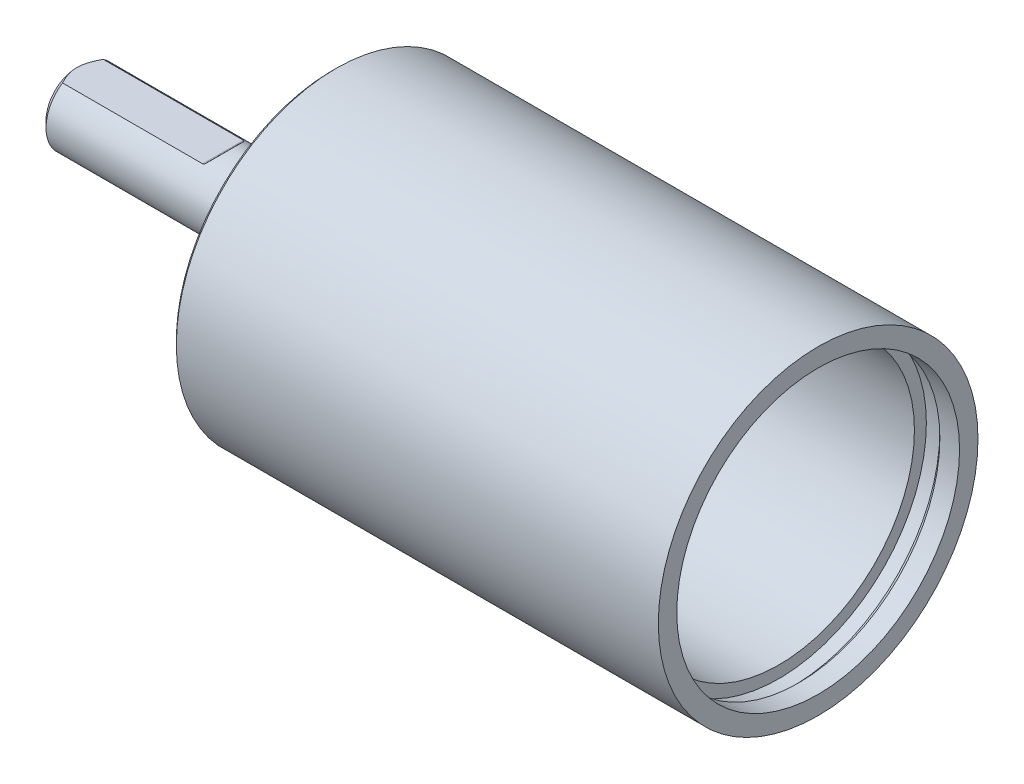
ISO-10303-21;
HEADER;
FILE_DESCRIPTION(('STEP AP214'),'2;1');
FILE_NAME('part.step','',(''),(''),'','','');
FILE_SCHEMA(('AUTOMOTIVE_DESIGN { 1 0 10303 214 1 1 1 1 }'));
ENDSEC;
DATA;
#1=APPLICATION_CONTEXT('core data for automotive mechanical design processes');
#2=APPLICATION_PROTOCOL_DEFINITION('international standard','automotive_design',2000,#1);
#3=PRODUCT_CONTEXT('',#1,'mechanical');
#4=PRODUCT('Part','Part','',(#3));
#5=PRODUCT_RELATED_PRODUCT_CATEGORY('part','',(#4));
#6=PRODUCT_DEFINITION_FORMATION('','',#4);
#7=PRODUCT_DEFINITION_CONTEXT('part definition',#1,'design');
#8=PRODUCT_DEFINITION('design','',#6,#7);
#9=PRODUCT_DEFINITION_SHAPE('','',#8);
#10=(LENGTH_UNIT() NAMED_UNIT(*) SI_UNIT(.MILLI.,.METRE.));
#11=(NAMED_UNIT(*) PLANE_ANGLE_UNIT() SI_UNIT($,.RADIAN.));
#12=(NAMED_UNIT(*) SI_UNIT($,.STERADIAN.) SOLID_ANGLE_UNIT());
#13=UNCERTAINTY_MEASURE_WITH_UNIT(LENGTH_MEASURE(1.E-05),#10,'distance_accuracy_value','');
#14=(GEOMETRIC_REPRESENTATION_CONTEXT(3) GLOBAL_UNCERTAINTY_ASSIGNED_CONTEXT((#13)) GLOBAL_UNIT_ASSIGNED_CONTEXT((#10,
#11,#12)) REPRESENTATION_CONTEXT('',''));
#15=CARTESIAN_POINT('',(0.,0.,0.));
#16=DIRECTION('',(0.,0.,1.));
#17=DIRECTION('',(1.,0.,0.));
#18=AXIS2_PLACEMENT_3D('',#15,#16,#17);
#19=CARTESIAN_POINT('',(-8.8,2.5,-2.));
#20=DIRECTION('',(0.707106781186548,-0.707106781186548,0.));
#21=DIRECTION('',(0.707106781186548,0.707106781186548,0.));
#22=AXIS2_PLACEMENT_3D('',#19,#20,#21);
#23=PLANE('',#22);
#24=CARTESIAN_POINT('',(-11.3,0.,0.));
#25=DIRECTION('',(0.707106781186548,-0.707106781186548,0.));
#26=DIRECTION('',(0.707106781186548,0.707106781186548,0.));
#27=AXIS2_PLACEMENT_3D('',#24,#25,#26);
#28=ELLIPSE('',#27,4.24264068711928,3.);
#29=CARTESIAN_POINT('',(-8.7267766952967,2.57322330470302,-1.54224570809353));
#30=VERTEX_POINT('',#29);
#31=CARTESIAN_POINT('',(-8.7267766952969,2.57322330470296,1.54224570809349));
#32=VERTEX_POINT('',#31);
#33=EDGE_CURVE('E76',#30,#32,#28,.T.);
#34=ORIENTED_EDGE('',*,*,#33,.F.);
#35=DIRECTION('',(0.,0.,-1.));
#36=VECTOR('',#35,1.);
#37=CARTESIAN_POINT('',(-8.72677669529686,2.57322330470286,1.768839200574));
#38=LINE('',#37,#36);
#39=EDGE_CURVE('E80',#30,#32,#38,.F.);
#40=ORIENTED_EDGE('',*,*,#39,.T.);
#41=EDGE_LOOP('',(#34,#40));
#42=FACE_BOUND('',#41,.T.);
#43=ADVANCED_FACE('F16',(#42),#23,.F.);
#44=CARTESIAN_POINT('',(-20.8,0.,0.));
#45=DIRECTION('',(1.,0.,0.));
#46=DIRECTION('',(0.,0.,-1.));
#47=AXIS2_PLACEMENT_3D('',#44,#45,#46);
#48=PLANE('',#47);
#49=CARTESIAN_POINT('',(-20.8,0.,0.));
#50=DIRECTION('',(1.,0.,0.));
#51=DIRECTION('',(0.,0.,-1.));
#52=AXIS2_PLACEMENT_3D('',#49,#50,#51);
#53=CIRCLE('',#52,2.49992345773656);
#54=CARTESIAN_POINT('',(-20.799981424196,-2.49996731649116,1.17829711520544E-08));
#55=VERTEX_POINT('',#54);
#56=CARTESIAN_POINT('',(-20.7999758215565,2.4999766015716,5.32391944272946E-08));
#57=VERTEX_POINT('',#56);
#58=EDGE_CURVE('E185',#55,#57,#53,.T.);
#59=ORIENTED_EDGE('',*,*,#58,.F.);
#60=CARTESIAN_POINT('',(-20.8,0.,0.));
#61=DIRECTION('',(1.,0.,0.));
#62=DIRECTION('',(0.,0.,-1.));
#63=AXIS2_PLACEMENT_3D('',#60,#61,#62);
#64=CIRCLE('',#63,2.4999234577305);
#65=EDGE_CURVE('E95',#57,#55,#64,.T.);
#66=ORIENTED_EDGE('',*,*,#65,.F.);
#67=EDGE_LOOP('',(#59,#66));
#68=FACE_BOUND('',#67,.T.);
#69=ADVANCED_FACE('F362',(#68),#48,.F.);
#70=CARTESIAN_POINT('',(-8.903553390593,2.75,1.768839200574));
#71=DIRECTION('',(0.,0.,-1.));
#72=DIRECTION('',(-1.,0.,0.));
#73=AXIS2_PLACEMENT_3D('',#70,#71,#72);
#74=CYLINDRICAL_SURFACE('',#73,0.25);
#75=CARTESIAN_POINT('',(-8.903553390593,2.5,-1.6583123951777));
#76=CARTESIAN_POINT('',(-8.89379152588564,2.49998042602031,-1.65833896948888));
#77=CARTESIAN_POINT('',(-8.88407297181455,2.50057050741547,-1.65745251620162));
#78=CARTESIAN_POINT('',(-8.8651645262979,2.50278954640737,-1.6541012176045));
#79=CARTESIAN_POINT('',(-8.85596928397319,2.50440443037962,-1.65165775290296));
#80=CARTESIAN_POINT('',(-8.83831457217026,2.5084908797649,-1.64544409868411));
#81=CARTESIAN_POINT('',(-8.82985165715079,2.51095812606447,-1.64168059665469));
#82=CARTESIAN_POINT('',(-8.81369147002877,2.51655173413125,-1.63309338244461));
#83=CARTESIAN_POINT('',(-8.80599716917573,2.51968051826178,-1.62826577095842));
#84=CARTESIAN_POINT('',(-8.78738621552995,2.52827717183096,-1.61490156190778));
#85=CARTESIAN_POINT('',(-8.77704082226438,2.53408169553418,-1.60579029414654));
#86=CARTESIAN_POINT('',(-8.75812365205936,2.54633829491558,-1.58628312619689));
#87=CARTESIAN_POINT('',(-8.74955500485647,2.55279148403187,-1.57588500980239));
#88=CARTESIAN_POINT('',(-8.73641625783787,2.56395450399931,-1.55763128899619));
#89=CARTESIAN_POINT('',(-8.7314382844151,2.56857078620708,-1.55001066898685));
#90=CARTESIAN_POINT('',(-8.72677669529621,2.5732233047031,-1.54224570809357));
#91=B_SPLINE_CURVE_WITH_KNOTS('',3,(#75,#76,#77,#78,#79,#80,#81,#82,#83,#84,#85,#86,#87,#88,#89,
#90),.UNSPECIFIED.,.F.,.F.,(4,2,2,2,2,2,2,4),(0.,0.0291591243152782,0.0579262244930341,
0.0865496429497564,0.115279745860272,0.159898865419011,0.20459592606371,0.235167563241156),.UNSPECIFIED.);
#92=CARTESIAN_POINT('',(-8.903553390593,2.49999999999997,-1.6583123951778));
#93=VERTEX_POINT('',#92);
#94=EDGE_CURVE('E85',#93,#30,#91,.T.);
#95=ORIENTED_EDGE('',*,*,#94,.F.);
#96=DIRECTION('',(0.,0.,-1.));
#97=VECTOR('',#96,1.);
#98=CARTESIAN_POINT('',(-8.903553390593,2.5,-2.));
#99=LINE('',#98,#97);
#100=CARTESIAN_POINT('',(-8.903553390593,2.49999999999997,1.6583123951778));
#101=VERTEX_POINT('',#100);
#102=EDGE_CURVE('E151',#93,#101,#99,.F.);
#103=ORIENTED_EDGE('',*,*,#102,.T.);
#104=CARTESIAN_POINT('',(-8.72677669529655,2.57322330470318,1.54224570809338));
#105=CARTESIAN_POINT('',(-8.73439985939456,2.56563624302286,1.55491918280162));
#106=CARTESIAN_POINT('',(-8.74289649208601,2.55809251140704,1.56727898662057));
#107=CARTESIAN_POINT('',(-8.76210852169701,2.54349226001647,1.59085851720823));
#108=CARTESIAN_POINT('',(-8.77285794877779,2.53644573210839,1.60205628000283));
#109=CARTESIAN_POINT('',(-8.79208402009956,2.5260770837503,1.61832921183306));
#110=CARTESIAN_POINT('',(-8.79977967658194,2.52238371853126,1.62407499191907));
#111=CARTESIAN_POINT('',(-8.81607913012832,2.5156376942397,1.63450449227756));
#112=CARTESIAN_POINT('',(-8.82467868839842,2.51258222906481,1.63919287166731));
#113=CARTESIAN_POINT('',(-8.84122182883237,2.50776865197648,1.64654564282677));
#114=CARTESIAN_POINT('',(-8.84903391565741,2.50587894599228,1.64941753453926));
#115=CARTESIAN_POINT('',(-8.86512286460602,2.50283671773989,1.654030271711));
#116=CARTESIAN_POINT('',(-8.8733989382924,2.50168298383189,1.65577297623978));
#117=CARTESIAN_POINT('',(-8.88538609137738,2.50063457326736,1.65735542278128));
#118=CARTESIAN_POINT('',(-8.88900600754822,2.50039713273377,1.65771357331457));
#119=CARTESIAN_POINT('',(-8.89626777107052,2.50007977470023,1.65819214007039));
#120=CARTESIAN_POINT('',(-8.89990961485514,2.49999983224014,1.65831259396288));
#121=CARTESIAN_POINT('',(-8.90355339059295,2.49999999999995,1.65831239517805));
#122=B_SPLINE_CURVE_WITH_KNOTS('',3,(#104,#105,#106,#107,#108,#109,#110,#111,#112,#113,#114,
#115,#116,#117,#118,#119,#120,#121),.UNSPECIFIED.,.F.,.F.,(4,2,2,2,2,2,2,2,4),(0.,
0.0500719921749167,0.100963298853835,0.131739799136617,0.162377920913957,0.18788278073848,
0.213345542491243,0.224272008855421,0.235196743463483),.UNSPECIFIED.);
#123=EDGE_CURVE('E82',#32,#101,#122,.T.);
#124=ORIENTED_EDGE('',*,*,#123,.F.);
#125=ORIENTED_EDGE('',*,*,#39,.F.);
#126=EDGE_LOOP('',(#95,#103,#124,#125));
#127=FACE_BOUND('',#126,.T.);
#128=ADVANCED_FACE('F94',(#127),#74,.F.);
#129=CARTESIAN_POINT('',(9.5,0.,0.));
#130=DIRECTION('',(1.,0.,0.));
#131=DIRECTION('',(0.,0.,-1.));
#132=AXIS2_PLACEMENT_3D('',#129,#130,#131);
#133=PLANE('',#132);
#134=CARTESIAN_POINT('',(9.5,0.,0.));
#135=DIRECTION('',(1.,0.,0.));
#136=DIRECTION('',(0.,0.,-1.));
#137=AXIS2_PLACEMENT_3D('',#134,#135,#136);
#138=CIRCLE('',#137,11.03);
#139=CARTESIAN_POINT('',(9.5,0.,-11.03));
#140=VERTEX_POINT('',#139);
#141=EDGE_CURVE('E146',#140,#140,#138,.T.);
#142=ORIENTED_EDGE('',*,*,#141,.T.);
#143=EDGE_LOOP('',(#142));
#144=FACE_BOUND('',#143,.T.);
#145=ADVANCED_FACE('F177',(#144),#133,.T.);
#146=CARTESIAN_POINT('',(-20.2969076971158,0.,0.));
#147=DIRECTION('',(1.,0.,0.));
#148=DIRECTION('',(0.,0.,-1.));
#149=AXIS2_PLACEMENT_3D('',#146,#147,#148);
#150=CONICAL_SURFACE('',#149,3.00300035752343,0.785382854748321);
#151=CARTESIAN_POINT('',(-20.2999081465035,0.,0.));
#152=DIRECTION('',(1.,0.,0.));
#153=DIRECTION('',(0.,0.,-1.));
#154=AXIS2_PLACEMENT_3D('',#151,#152,#153);
#155=CIRCLE('',#154,3.);
#156=CARTESIAN_POINT('',(-20.2999081464913,2.5,1.6583123951997));
#157=VERTEX_POINT('',#156);
#158=CARTESIAN_POINT('',(-20.2999615609539,-2.99998026444618,8.8767050043193E-09));
#159=VERTEX_POINT('',#158);
#160=EDGE_CURVE('E143',#157,#159,#155,.T.);
#161=ORIENTED_EDGE('',*,*,#160,.F.);
#162=CARTESIAN_POINT('',(-20.2999081464732,2.49999999998664,1.65831239521841));
#163=CARTESIAN_POINT('',(-20.3249284497094,2.49999999999508,1.61304507450224));
#164=CARTESIAN_POINT('',(-20.349408141313,2.49999999999865,1.56747958268578));
#165=CARTESIAN_POINT('',(-20.3971190087082,2.50000000000135,1.47571715334427));
#166=CARTESIAN_POINT('',(-20.420350543765,2.50000000000047,1.42952040237308));
#167=CARTESIAN_POINT('',(-20.4881443870953,2.49999999999905,1.28947599850154));
#168=CARTESIAN_POINT('',(-20.5305799345796,2.49999999999975,1.19457692156773));
#169=CARTESIAN_POINT('',(-20.6070770806091,2.50000000000024,1.00437051733474));
#170=CARTESIAN_POINT('',(-20.6413323769357,2.50000000000006,0.909142070828953));
#171=CARTESIAN_POINT('',(-20.7010342523479,2.49999999999994,0.715978246473971));
#172=CARTESIAN_POINT('',(-20.7264871309224,2.49999999999998,0.618044858855863));
#173=CARTESIAN_POINT('',(-20.7638709014638,2.50000000000001,0.43411383278302));
#174=CARTESIAN_POINT('',(-20.7772138348853,2.5,0.348409151925357));
#175=CARTESIAN_POINT('',(-20.7907490808557,2.5,0.218715155345479));
#176=CARTESIAN_POINT('',(-20.7941816302222,2.5,0.175049438598595));
#177=CARTESIAN_POINT('',(-20.7987717790547,2.5,0.0875918067143618));
#178=CARTESIAN_POINT('',(-20.7999290058614,2.5,0.0437998720807064));
#179=CARTESIAN_POINT('',(-20.799923455387,2.5,5.32380789714912E-08));
#180=B_SPLINE_CURVE_WITH_KNOTS('',3,(#162,#163,#164,#165,#166,#167,#168,#169,#170,#171,#172,
#173,#174,#175,#176,#177,#178,#179),.UNSPECIFIED.,.F.,.F.,(4,2,2,2,2,2,2,2,4),(0.,
0.155158197363519,0.310271492592634,0.621881513987249,0.925152907293875,1.22820681177174,
1.48797818183027,1.61932604998984,1.7506954289149),.UNSPECIFIED.);
#181=EDGE_CURVE('E154',#157,#57,#180,.T.);
#182=ORIENTED_EDGE('',*,*,#181,.T.);
#183=ORIENTED_EDGE('',*,*,#65,.T.);
#184=CARTESIAN_POINT('',(-20.2999540782685,-2.99995406953713,1.06046245725402E-08));
#185=CARTESIAN_POINT('',(-20.3207877305419,-2.97912105513546,1.0678269271504E-08));
#186=CARTESIAN_POINT('',(-20.3416213828058,-2.95828804072414,1.07488454716468E-08));
#187=CARTESIAN_POINT('',(-20.3832886873524,-2.91662201188255,1.08838608749792E-08));
#188=CARTESIAN_POINT('',(-20.4041223396352,-2.89578899745228,1.09483000781631E-08));
#189=CARTESIAN_POINT('',(-20.4457896441916,-2.85412296863947,1.10710414880483E-08));
#190=CARTESIAN_POINT('',(-20.4666232964653,-2.83328995425693,1.1129343694758E-08));
#191=CARTESIAN_POINT('',(-20.5082906010207,-2.79162392544306,1.12398111108953E-08));
#192=CARTESIAN_POINT('',(-20.5291242533024,-2.77079091101174,1.12919763203145E-08));
#193=CARTESIAN_POINT('',(-20.5707915578711,-2.72912488215437,1.13901697423234E-08));
#194=CARTESIAN_POINT('',(-20.5916252101582,-2.70829186772833,1.14361979549129E-08));
#195=CARTESIAN_POINT('',(-20.6332925147125,-2.66662583889442,1.1522117383394E-08));
#196=CARTESIAN_POINT('',(-20.6541261669797,-2.64579282448656,1.15620085992911E-08));
#197=CARTESIAN_POINT('',(-20.6957934715311,-2.60412679564969,1.16356540339468E-08));
#198=CARTESIAN_POINT('',(-20.7166271238151,-2.5832937812207,1.16694082526997E-08));
#199=CARTESIAN_POINT('',(-20.7582944283643,-2.54162775240062,1.17307796934837E-08));
#200=CARTESIAN_POINT('',(-20.7791280806294,-2.52079473800952,1.17583969155233E-08));
#201=CARTESIAN_POINT('',(-20.7999617329051,-2.49996172362899,1.17829456394829E-08));
#202=B_SPLINE_CURVE_WITH_KNOTS('',3,(#184,#185,#186,#187,#188,#189,#190,#191,#192,#193,#194,
#195,#196,#197,#198,#199,#200,#201),.UNSPECIFIED.,.F.,.F.,(4,2,2,2,2,2,2,2,4),(0.,
0.0883883476766826,0.176776695433754,0.265165043070243,0.353553390827314,0.441941738584385,
0.530330086261068,0.618718434018139,0.707106781654628),.UNSPECIFIED.);
#203=EDGE_CURVE('E97',#159,#55,#202,.T.);
#204=ORIENTED_EDGE('',*,*,#203,.F.);
#205=EDGE_LOOP('',(#161,#182,#183,#204));
#206=FACE_BOUND('',#205,.T.);
#207=ADVANCED_FACE('F170',(#206),#150,.T.);
#208=CARTESIAN_POINT('',(-20.2969076984232,0.,0.));
#209=DIRECTION('',(1.,0.,0.));
#210=DIRECTION('',(0.,0.,-1.));
#211=AXIS2_PLACEMENT_3D('',#208,#209,#210);
#212=CONICAL_SURFACE('',#211,3.00300035615919,0.78538285468577);
#213=ORIENTED_EDGE('',*,*,#58,.T.);
#214=CARTESIAN_POINT('',(-20.799923455393,2.5,5.32380792097687E-08));
#215=CARTESIAN_POINT('',(-20.7999877721281,2.5,-0.076840708517661));
#216=CARTESIAN_POINT('',(-20.7963821086739,2.5,-0.153642412975024));
#217=CARTESIAN_POINT('',(-20.7823376907183,2.5,-0.306478571908375));
#218=CARTESIAN_POINT('',(-20.7719118715402,2.5,-0.382514202693761));
#219=CARTESIAN_POINT('',(-20.7449479260042,2.5,-0.532216696731756));
#220=CARTESIAN_POINT('',(-20.7285102528714,2.5,-0.605901995269937));
#221=CARTESIAN_POINT('',(-20.6902537568891,2.5,-0.751876550019934));
#222=CARTESIAN_POINT('',(-20.6684328360924,2.5,-0.824165250080604));
#223=CARTESIAN_POINT('',(-20.6221678001839,2.5,-0.961338848208512));
#224=CARTESIAN_POINT('',(-20.5980831344242,2.5,-1.02634648625309));
#225=CARTESIAN_POINT('',(-20.5466195970902,2.5,-1.15503976613259));
#226=CARTESIAN_POINT('',(-20.5192405842774,2.5,-1.21872535114979));
#227=CARTESIAN_POINT('',(-20.4612627636989,2.5,-1.34580382683491));
#228=CARTESIAN_POINT('',(-20.4306204553711,2.5,-1.40917671579096));
#229=CARTESIAN_POINT('',(-20.3669472112327,2.5,-1.53465741947381));
#230=CARTESIAN_POINT('',(-20.3339179906258,2.5,-1.59676610230799));
#231=CARTESIAN_POINT('',(-20.2999081464359,2.5,-1.65831239519777));
#232=B_SPLINE_CURVE_WITH_KNOTS('',3,(#214,#215,#216,#217,#218,#219,#220,#221,#222,#223,#224,
#225,#226,#227,#228,#229,#230,#231),.UNSPECIFIED.,.F.,.F.,(4,2,2,2,2,2,2,2,4),(0.,
0.230375494620024,0.460315313693583,0.686576548684705,0.91292610138132,1.12080184201164,
1.32868649807645,1.53980841961164,1.750780112005),.UNSPECIFIED.);
#233=CARTESIAN_POINT('',(-20.2999081464414,2.49999999999993,-1.65831239518784));
#234=VERTEX_POINT('',#233);
#235=EDGE_CURVE('E152',#57,#234,#232,.T.);
#236=ORIENTED_EDGE('',*,*,#235,.T.);
#237=CARTESIAN_POINT('',(-20.299908146447,0.,0.));
#238=DIRECTION('',(1.,0.,0.));
#239=DIRECTION('',(0.,0.,-1.));
#240=AXIS2_PLACEMENT_3D('',#237,#238,#239);
#241=CIRCLE('',#240,3.);
#242=EDGE_CURVE('E138',#159,#234,#241,.T.);
#243=ORIENTED_EDGE('',*,*,#242,.F.);
#244=ORIENTED_EDGE('',*,*,#203,.T.);
#245=EDGE_LOOP('',(#213,#236,#243,#244));
#246=FACE_BOUND('',#245,.T.);
#247=ADVANCED_FACE('F166',(#246),#212,.T.);
#248=CARTESIAN_POINT('',(-20.8,2.5,-2.));
#249=DIRECTION('',(0.,-1.,0.));
#250=DIRECTION('',(0.,0.,-1.));
#251=AXIS2_PLACEMENT_3D('',#248,#249,#250);
#252=PLANE('',#251);
#253=DIRECTION('',(1.,0.,0.));
#254=VECTOR('',#253,1.);
#255=CARTESIAN_POINT('',(-20.80000369,2.49999999999986,-1.65831239517791));
#256=LINE('',#255,#254);
#257=EDGE_CURVE('E89',#234,#93,#256,.T.);
#258=ORIENTED_EDGE('',*,*,#257,.F.);
#259=ORIENTED_EDGE('',*,*,#235,.F.);
#260=ORIENTED_EDGE('',*,*,#181,.F.);
#261=DIRECTION('',(1.,0.,0.));
#262=VECTOR('',#261,1.);
#263=CARTESIAN_POINT('',(-20.80000369,2.49999999999986,1.65831239517791));
#264=LINE('',#263,#262);
#265=EDGE_CURVE('E140',#101,#157,#264,.F.);
#266=ORIENTED_EDGE('',*,*,#265,.F.);
#267=ORIENTED_EDGE('',*,*,#102,.F.);
#268=EDGE_LOOP('',(#258,#259,#260,#266,#267));
#269=FACE_BOUND('',#268,.T.);
#270=ADVANCED_FACE('F163',(#269),#252,.F.);
#271=CARTESIAN_POINT('',(-20.80000369,0.,0.));
#272=DIRECTION('',(1.,0.,0.));
#273=DIRECTION('',(0.,0.,-1.));
#274=AXIS2_PLACEMENT_3D('',#271,#272,#273);
#275=CYLINDRICAL_SURFACE('',#274,11.03);
#276=ORIENTED_EDGE('',*,*,#141,.F.);
#277=EDGE_LOOP('',(#276));
#278=FACE_BOUND('',#277,.T.);
#279=CARTESIAN_POINT('',(36.3,0.,0.));
#280=DIRECTION('',(1.,0.,0.));
#281=DIRECTION('',(0.,0.,-1.));
#282=AXIS2_PLACEMENT_3D('',#279,#280,#281);
#283=CIRCLE('',#282,11.03);
#284=CARTESIAN_POINT('',(36.3,0.,-11.03));
#285=VERTEX_POINT('',#284);
#286=EDGE_CURVE('E135',#285,#285,#283,.F.);
#287=ORIENTED_EDGE('',*,*,#286,.F.);
#288=EDGE_LOOP('',(#287));
#289=FACE_BOUND('',#288,.T.);
#290=ADVANCED_FACE('F204',(#278,#289),#275,.F.);
#291=CARTESIAN_POINT('',(-20.80000369,0.,0.));
#292=DIRECTION('',(1.,0.,0.));
#293=DIRECTION('',(0.,0.,-1.));
#294=AXIS2_PLACEMENT_3D('',#291,#292,#293);
#295=CYLINDRICAL_SURFACE('',#294,3.);
#296=CARTESIAN_POINT('',(-2.,0.,0.));
#297=DIRECTION('',(1.,0.,0.));
#298=DIRECTION('',(0.,0.,-1.));
#299=AXIS2_PLACEMENT_3D('',#296,#297,#298);
#300=CIRCLE('',#299,3.);
#301=CARTESIAN_POINT('',(-2.,0.,-3.));
#302=VERTEX_POINT('',#301);
#303=EDGE_CURVE('E132',#302,#302,#300,.F.);
#304=ORIENTED_EDGE('',*,*,#303,.T.);
#305=EDGE_LOOP('',(#304));
#306=FACE_BOUND('',#305,.T.);
#307=ORIENTED_EDGE('',*,*,#94,.T.);
#308=ORIENTED_EDGE('',*,*,#33,.T.);
#309=ORIENTED_EDGE('',*,*,#123,.T.);
#310=ORIENTED_EDGE('',*,*,#265,.T.);
#311=ORIENTED_EDGE('',*,*,#160,.T.);
#312=ORIENTED_EDGE('',*,*,#242,.T.);
#313=ORIENTED_EDGE('',*,*,#257,.T.);
#314=EDGE_LOOP('',(#307,#308,#309,#310,#311,#312,#313));
#315=FACE_BOUND('',#314,.T.);
#316=ADVANCED_FACE('F86',(#306,#315),#295,.T.);
#317=CARTESIAN_POINT('',(36.3,0.,0.));
#318=DIRECTION('',(1.,0.,0.));
#319=DIRECTION('',(0.,0.,-1.));
#320=AXIS2_PLACEMENT_3D('',#317,#318,#319);
#321=PLANE('',#320);
#322=ORIENTED_EDGE('',*,*,#286,.T.);
#323=EDGE_LOOP('',(#322));
#324=FACE_BOUND('',#323,.T.);
#325=CARTESIAN_POINT('',(36.3,0.,0.));
#326=DIRECTION('',(1.,0.,0.));
#327=DIRECTION('',(0.,0.,-1.));
#328=AXIS2_PLACEMENT_3D('',#325,#326,#327);
#329=CIRCLE('',#328,12.);
#330=CARTESIAN_POINT('',(36.3,0.,-12.));
#331=VERTEX_POINT('',#330);
#332=EDGE_CURVE('E129',#331,#331,#329,.T.);
#333=ORIENTED_EDGE('',*,*,#332,.T.);
#334=EDGE_LOOP('',(#333));
#335=FACE_BOUND('',#334,.T.);
#336=ADVANCED_FACE('F203',(#324,#335),#321,.T.);
#337=CARTESIAN_POINT('',(-2.,0.,0.));
#338=DIRECTION('',(1.,0.,0.));
#339=DIRECTION('',(0.,0.,-1.));
#340=AXIS2_PLACEMENT_3D('',#337,#338,#339);
#341=PLANE('',#340);
#342=ORIENTED_EDGE('',*,*,#303,.F.);
#343=EDGE_LOOP('',(#342));
#344=FACE_BOUND('',#343,.T.);
#345=CARTESIAN_POINT('',(-1.99999999999997,0.,0.));
#346=DIRECTION('',(1.,0.,0.));
#347=DIRECTION('',(0.,-1.,0.));
#348=AXIS2_PLACEMENT_3D('',#345,#346,#347);
#349=CIRCLE('',#348,6.999999823942);
#350=CARTESIAN_POINT('',(-1.99999999999996,-6.9999997183072,0.));
#351=VERTEX_POINT('',#350);
#352=CARTESIAN_POINT('',(-1.99999999999996,6.9999997183072,0.));
#353=VERTEX_POINT('',#352);
#354=EDGE_CURVE('E314',#351,#353,#349,.T.);
#355=ORIENTED_EDGE('',*,*,#354,.F.);
#356=CARTESIAN_POINT('',(-1.99999999999988,0.,0.));
#357=DIRECTION('',(1.,0.,0.));
#358=DIRECTION('',(0.,1.,0.));
#359=AXIS2_PLACEMENT_3D('',#356,#357,#358);
#360=CIRCLE('',#359,6.999999647884);
#361=EDGE_CURVE('E35',#353,#351,#360,.T.);
#362=ORIENTED_EDGE('',*,*,#361,.F.);
#363=EDGE_LOOP('',(#355,#362));
#364=FACE_BOUND('',#363,.T.);
#365=ADVANCED_FACE('F321',(#344,#364),#341,.F.);
#366=CARTESIAN_POINT('',(3.99999999990541,0.,-10.));
#367=DIRECTION('',(-1.,0.,0.));
#368=DIRECTION('',(0.,0.,1.));
#369=AXIS2_PLACEMENT_3D('',#366,#367,#368);
#370=CONICAL_SURFACE('',#369,1.25000000014097,1.02974425868194);
#371=CARTESIAN_POINT('',(4.,0.,-10.));
#372=DIRECTION('',(-1.,0.,0.));
#373=DIRECTION('',(0.,0.,1.));
#374=AXIS2_PLACEMENT_3D('',#371,#372,#373);
#375=CIRCLE('',#374,1.25);
#376=CARTESIAN_POINT('',(4.,0.,-8.75));
#377=VERTEX_POINT('',#376);
#378=EDGE_CURVE('E311',#377,#377,#375,.T.);
#379=ORIENTED_EDGE('',*,*,#378,.T.);
#380=EDGE_LOOP('',(#379));
#381=FACE_BOUND('',#380,.T.);
#382=CARTESIAN_POINT('',(4.75107577369727,0.,-10.));
#383=VERTEX_POINT('',#382);
#384=VERTEX_LOOP('',#383);
#385=FACE_BOUND('',#384,.T.);
#386=ADVANCED_FACE('F330',(#381,#385),#370,.F.);
#387=CARTESIAN_POINT('',(3.99999999990541,10.,0.));
#388=DIRECTION('',(-1.,0.,0.));
#389=DIRECTION('',(0.,0.,1.));
#390=AXIS2_PLACEMENT_3D('',#387,#388,#389);
#391=CONICAL_SURFACE('',#390,1.25000000014097,1.02974425868194);
#392=CARTESIAN_POINT('',(4.,10.,0.));
#393=DIRECTION('',(-1.,0.,0.));
#394=DIRECTION('',(0.,0.,1.));
#395=AXIS2_PLACEMENT_3D('',#392,#393,#394);
#396=CIRCLE('',#395,1.25);
#397=CARTESIAN_POINT('',(4.,10.,1.25));
#398=VERTEX_POINT('',#397);
#399=EDGE_CURVE('E308',#398,#398,#396,.T.);
#400=ORIENTED_EDGE('',*,*,#399,.T.);
#401=EDGE_LOOP('',(#400));
#402=FACE_BOUND('',#401,.T.);
#403=CARTESIAN_POINT('',(4.75107577369727,10.,0.));
#404=VERTEX_POINT('',#403);
#405=VERTEX_LOOP('',#404);
#406=FACE_BOUND('',#405,.T.);
#407=ADVANCED_FACE('F445',(#402,#406),#391,.F.);
#408=CARTESIAN_POINT('',(3.99999999990541,0.,10.));
#409=DIRECTION('',(-1.,0.,0.));
#410=DIRECTION('',(0.,0.,1.));
#411=AXIS2_PLACEMENT_3D('',#408,#409,#410);
#412=CONICAL_SURFACE('',#411,1.25000000014097,1.02974425868194);
#413=CARTESIAN_POINT('',(4.,0.,10.));
#414=DIRECTION('',(-1.,0.,0.));
#415=DIRECTION('',(0.,0.,1.));
#416=AXIS2_PLACEMENT_3D('',#413,#414,#415);
#417=CIRCLE('',#416,1.25);
#418=CARTESIAN_POINT('',(4.,0.,11.25));
#419=VERTEX_POINT('',#418);
#420=EDGE_CURVE('E305',#419,#419,#417,.T.);
#421=ORIENTED_EDGE('',*,*,#420,.T.);
#422=EDGE_LOOP('',(#421));
#423=FACE_BOUND('',#422,.T.);
#424=CARTESIAN_POINT('',(4.75107577369727,0.,10.));
#425=VERTEX_POINT('',#424);
#426=VERTEX_LOOP('',#425);
#427=FACE_BOUND('',#426,.T.);
#428=ADVANCED_FACE('F454',(#423,#427),#412,.F.);
#429=CARTESIAN_POINT('',(3.99999999990541,-10.,0.));
#430=DIRECTION('',(-1.,0.,0.));
#431=DIRECTION('',(0.,0.,1.));
#432=AXIS2_PLACEMENT_3D('',#429,#430,#431);
#433=CONICAL_SURFACE('',#432,1.25000000014097,1.02974425868194);
#434=CARTESIAN_POINT('',(4.,-10.,0.));
#435=DIRECTION('',(-1.,0.,0.));
#436=DIRECTION('',(0.,0.,1.));
#437=AXIS2_PLACEMENT_3D('',#434,#435,#436);
#438=CIRCLE('',#437,1.25);
#439=CARTESIAN_POINT('',(4.,-10.,1.25));
#440=VERTEX_POINT('',#439);
#441=EDGE_CURVE('E302',#440,#440,#438,.T.);
#442=ORIENTED_EDGE('',*,*,#441,.T.);
#443=EDGE_LOOP('',(#442));
#444=FACE_BOUND('',#443,.T.);
#445=CARTESIAN_POINT('',(4.75107577369727,-10.,0.));
#446=VERTEX_POINT('',#445);
#447=VERTEX_LOOP('',#446);
#448=FACE_BOUND('',#447,.T.);
#449=ADVANCED_FACE('F463',(#444,#448),#433,.F.);
#450=CARTESIAN_POINT('',(-20.80000369,0.,0.));
#451=DIRECTION('',(1.,0.,0.));
#452=DIRECTION('',(0.,0.,-1.));
#453=AXIS2_PLACEMENT_3D('',#450,#451,#452);
#454=CYLINDRICAL_SURFACE('',#453,12.);
#455=ORIENTED_EDGE('',*,*,#332,.F.);
#456=EDGE_LOOP('',(#455));
#457=FACE_BOUND('',#456,.T.);
#458=CARTESIAN_POINT('',(37.4,0.,0.));
#459=DIRECTION('',(-1.,0.,0.));
#460=DIRECTION('',(0.,1.,0.));
#461=AXIS2_PLACEMENT_3D('',#458,#459,#460);
#462=CIRCLE('',#461,12.);
#463=CARTESIAN_POINT('',(37.4,12.,0.));
#464=VERTEX_POINT('',#463);
#465=EDGE_CURVE('E299',#464,#464,#462,.F.);
#466=ORIENTED_EDGE('',*,*,#465,.T.);
#467=EDGE_LOOP('',(#466));
#468=FACE_BOUND('',#467,.T.);
#469=ADVANCED_FACE('F286',(#457,#468),#454,.F.);
#470=CARTESIAN_POINT('',(-1.5,0.,0.));
#471=DIRECTION('',(1.,0.,0.));
#472=DIRECTION('',(0.,0.999788408418033,0.0205703279734607));
#473=AXIS2_PLACEMENT_3D('',#470,#471,#472);
#474=TOROIDAL_SURFACE('',#473,7.,0.5);
#475=CARTESIAN_POINT('',(-1.5,0.,0.));
#476=DIRECTION('',(1.,0.,0.));
#477=DIRECTION('',(0.,0.,-1.));
#478=AXIS2_PLACEMENT_3D('',#475,#476,#477);
#479=CIRCLE('',#478,7.5);
#480=CARTESIAN_POINT('',(-1.5,0.,-7.5));
#481=VERTEX_POINT('',#480);
#482=EDGE_CURVE('E296',#481,#481,#479,.T.);
#483=ORIENTED_EDGE('',*,*,#482,.F.);
#484=EDGE_LOOP('',(#483));
#485=FACE_BOUND('',#484,.T.);
#486=ORIENTED_EDGE('',*,*,#354,.T.);
#487=ORIENTED_EDGE('',*,*,#361,.T.);
#488=EDGE_LOOP('',(#486,#487));
#489=FACE_BOUND('',#488,.T.);
#490=ADVANCED_FACE('F280',(#485,#489),#474,.T.);
#491=CARTESIAN_POINT('',(4.988629562474,0.,-10.));
#492=DIRECTION('',(-1.,0.,0.));
#493=DIRECTION('',(0.,0.,1.));
#494=AXIS2_PLACEMENT_3D('',#491,#492,#493);
#495=CYLINDRICAL_SURFACE('',#494,1.25);
#496=CARTESIAN_POINT('',(0.0500000000442924,0.,-10.));
#497=DIRECTION('',(-1.,0.,0.));
#498=DIRECTION('',(0.,1.,0.));
#499=AXIS2_PLACEMENT_3D('',#496,#497,#498);
#500=CIRCLE('',#499,1.24999999997044);
#501=CARTESIAN_POINT('',(0.0500000000442924,1.24999999997044,-10.));
#502=VERTEX_POINT('',#501);
#503=EDGE_CURVE('E294',#502,#502,#500,.T.);
#504=ORIENTED_EDGE('',*,*,#503,.T.);
#505=EDGE_LOOP('',(#504));
#506=FACE_BOUND('',#505,.T.);
#507=ORIENTED_EDGE('',*,*,#378,.F.);
#508=EDGE_LOOP('',(#507));
#509=FACE_BOUND('',#508,.T.);
#510=ADVANCED_FACE('F277',(#506,#509),#495,.F.);
#511=CARTESIAN_POINT('',(4.988629562474,10.,0.));
#512=DIRECTION('',(-1.,0.,0.));
#513=DIRECTION('',(0.,0.,1.));
#514=AXIS2_PLACEMENT_3D('',#511,#512,#513);
#515=CYLINDRICAL_SURFACE('',#514,1.25);
#516=CARTESIAN_POINT('',(0.0500000000442924,10.,0.));
#517=DIRECTION('',(-1.,0.,0.));
#518=DIRECTION('',(0.,0.,1.));
#519=AXIS2_PLACEMENT_3D('',#516,#517,#518);
#520=CIRCLE('',#519,1.24999999997044);
#521=CARTESIAN_POINT('',(0.0500000000442924,10.,1.24999999997044));
#522=VERTEX_POINT('',#521);
#523=EDGE_CURVE('E604',#522,#522,#520,.T.);
#524=ORIENTED_EDGE('',*,*,#523,.T.);
#525=EDGE_LOOP('',(#524));
#526=FACE_BOUND('',#525,.T.);
#527=ORIENTED_EDGE('',*,*,#399,.F.);
#528=EDGE_LOOP('',(#527));
#529=FACE_BOUND('',#528,.T.);
#530=ADVANCED_FACE('F273',(#526,#529),#515,.F.);
#531=CARTESIAN_POINT('',(4.988629562474,0.,10.));
#532=DIRECTION('',(-1.,0.,0.));
#533=DIRECTION('',(0.,0.,1.));
#534=AXIS2_PLACEMENT_3D('',#531,#532,#533);
#535=CYLINDRICAL_SURFACE('',#534,1.25);
#536=CARTESIAN_POINT('',(0.0500000000442924,0.,10.));
#537=DIRECTION('',(-1.,0.,0.));
#538=DIRECTION('',(0.,-1.,0.));
#539=AXIS2_PLACEMENT_3D('',#536,#537,#538);
#540=CIRCLE('',#539,1.24999999997044);
#541=CARTESIAN_POINT('',(0.0500000000442924,-1.24999999997044,10.));
#542=VERTEX_POINT('',#541);
#543=EDGE_CURVE('E600',#542,#542,#540,.T.);
#544=ORIENTED_EDGE('',*,*,#543,.T.);
#545=EDGE_LOOP('',(#544));
#546=FACE_BOUND('',#545,.T.);
#547=ORIENTED_EDGE('',*,*,#420,.F.);
#548=EDGE_LOOP('',(#547));
#549=FACE_BOUND('',#548,.T.);
#550=ADVANCED_FACE('F269',(#546,#549),#535,.F.);
#551=CARTESIAN_POINT('',(4.988629562474,-10.,0.));
#552=DIRECTION('',(-1.,0.,0.));
#553=DIRECTION('',(0.,0.,1.));
#554=AXIS2_PLACEMENT_3D('',#551,#552,#553);
#555=CYLINDRICAL_SURFACE('',#554,1.25);
#556=CARTESIAN_POINT('',(0.0500000000442924,-10.,0.));
#557=DIRECTION('',(-1.,0.,0.));
#558=DIRECTION('',(0.,0.,-1.));
#559=AXIS2_PLACEMENT_3D('',#556,#557,#558);
#560=CIRCLE('',#559,1.24999999997044);
#561=CARTESIAN_POINT('',(0.0500000000442924,-10.,-1.24999999997044));
#562=VERTEX_POINT('',#561);
#563=EDGE_CURVE('E597',#562,#562,#560,.T.);
#564=ORIENTED_EDGE('',*,*,#563,.T.);
#565=EDGE_LOOP('',(#564));
#566=FACE_BOUND('',#565,.T.);
#567=ORIENTED_EDGE('',*,*,#441,.F.);
#568=EDGE_LOOP('',(#567));
#569=FACE_BOUND('',#568,.T.);
#570=ADVANCED_FACE('F265',(#566,#569),#555,.F.);
#571=CARTESIAN_POINT('',(37.4,0.,0.));
#572=DIRECTION('',(-1.,0.,0.));
#573=DIRECTION('',(0.,0.,1.));
#574=AXIS2_PLACEMENT_3D('',#571,#572,#573);
#575=CONICAL_SURFACE('',#574,12.,0.785398163397299);
#576=ORIENTED_EDGE('',*,*,#465,.F.);
#577=EDGE_LOOP('',(#576));
#578=FACE_BOUND('',#577,.T.);
#579=CARTESIAN_POINT('',(37.9,0.,0.));
#580=DIRECTION('',(1.,0.,0.));
#581=DIRECTION('',(0.,0.,-1.));
#582=AXIS2_PLACEMENT_3D('',#579,#580,#581);
#583=CIRCLE('',#582,11.5);
#584=CARTESIAN_POINT('',(37.9,0.,-11.5));
#585=VERTEX_POINT('',#584);
#586=EDGE_CURVE('E128',#585,#585,#583,.T.);
#587=ORIENTED_EDGE('',*,*,#586,.T.);
#588=EDGE_LOOP('',(#587));
#589=FACE_BOUND('',#588,.T.);
#590=ADVANCED_FACE('F261',(#578,#589),#575,.F.);
#591=CARTESIAN_POINT('',(-20.80000369,0.,0.));
#592=DIRECTION('',(1.,0.,0.));
#593=DIRECTION('',(0.,0.,-1.));
#594=AXIS2_PLACEMENT_3D('',#591,#592,#593);
#595=CYLINDRICAL_SURFACE('',#594,7.5);
#596=CARTESIAN_POINT('',(0.,0.,0.));
#597=DIRECTION('',(1.,0.,0.));
#598=DIRECTION('',(0.,0.,-1.));
#599=AXIS2_PLACEMENT_3D('',#596,#597,#598);
#600=CIRCLE('',#599,7.5);
#601=CARTESIAN_POINT('',(0.,0.,-7.5));
#602=VERTEX_POINT('',#601);
#603=EDGE_CURVE('E125',#602,#602,#600,.F.);
#604=ORIENTED_EDGE('',*,*,#603,.T.);
#605=EDGE_LOOP('',(#604));
#606=FACE_BOUND('',#605,.T.);
#607=ORIENTED_EDGE('',*,*,#482,.T.);
#608=EDGE_LOOP('',(#607));
#609=FACE_BOUND('',#608,.T.);
#610=ADVANCED_FACE('F257',(#606,#609),#595,.T.);
#611=CARTESIAN_POINT('',(1.13686837721616E-10,0.,-10.));
#612=DIRECTION('',(-1.,0.,0.));
#613=DIRECTION('',(0.,0.,1.));
#614=AXIS2_PLACEMENT_3D('',#611,#612,#613);
#615=CONICAL_SURFACE('',#614,1.29999999990105,0.785398163397448);
#616=ORIENTED_EDGE('',*,*,#503,.F.);
#617=EDGE_LOOP('',(#616));
#618=FACE_BOUND('',#617,.T.);
#619=CARTESIAN_POINT('',(0.,0.,-10.));
#620=DIRECTION('',(-1.,0.,0.));
#621=DIRECTION('',(0.,0.,1.));
#622=AXIS2_PLACEMENT_3D('',#619,#620,#621);
#623=CIRCLE('',#622,1.30000000001473);
#624=CARTESIAN_POINT('',(0.,0.,-8.69999999998527));
#625=VERTEX_POINT('',#624);
#626=EDGE_CURVE('E122',#625,#625,#623,.T.);
#627=ORIENTED_EDGE('',*,*,#626,.T.);
#628=EDGE_LOOP('',(#627));
#629=FACE_BOUND('',#628,.T.);
#630=ADVANCED_FACE('F253',(#618,#629),#615,.F.);
#631=CARTESIAN_POINT('',(1.13686837721616E-10,10.,0.));
#632=DIRECTION('',(-1.,0.,0.));
#633=DIRECTION('',(0.,0.,1.));
#634=AXIS2_PLACEMENT_3D('',#631,#632,#633);
#635=CONICAL_SURFACE('',#634,1.29999999990105,0.785398163397448);
#636=ORIENTED_EDGE('',*,*,#523,.F.);
#637=EDGE_LOOP('',(#636));
#638=FACE_BOUND('',#637,.T.);
#639=CARTESIAN_POINT('',(0.,10.,0.));
#640=DIRECTION('',(-1.,0.,0.));
#641=DIRECTION('',(0.,0.,1.));
#642=AXIS2_PLACEMENT_3D('',#639,#640,#641);
#643=CIRCLE('',#642,1.30000000001473);
#644=CARTESIAN_POINT('',(0.,10.,1.30000000001473));
#645=VERTEX_POINT('',#644);
#646=EDGE_CURVE('E119',#645,#645,#643,.T.);
#647=ORIENTED_EDGE('',*,*,#646,.T.);
#648=EDGE_LOOP('',(#647));
#649=FACE_BOUND('',#648,.T.);
#650=ADVANCED_FACE('F249',(#638,#649),#635,.F.);
#651=CARTESIAN_POINT('',(1.13686837721616E-10,0.,10.));
#652=DIRECTION('',(-1.,0.,0.));
#653=DIRECTION('',(0.,0.,1.));
#654=AXIS2_PLACEMENT_3D('',#651,#652,#653);
#655=CONICAL_SURFACE('',#654,1.29999999990105,0.785398163397448);
#656=ORIENTED_EDGE('',*,*,#543,.F.);
#657=EDGE_LOOP('',(#656));
#658=FACE_BOUND('',#657,.T.);
#659=CARTESIAN_POINT('',(0.,0.,10.));
#660=DIRECTION('',(-1.,0.,0.));
#661=DIRECTION('',(0.,0.,1.));
#662=AXIS2_PLACEMENT_3D('',#659,#660,#661);
#663=CIRCLE('',#662,1.30000000001473);
#664=CARTESIAN_POINT('',(0.,0.,11.3000000000147));
#665=VERTEX_POINT('',#664);
#666=EDGE_CURVE('E116',#665,#665,#663,.T.);
#667=ORIENTED_EDGE('',*,*,#666,.T.);
#668=EDGE_LOOP('',(#667));
#669=FACE_BOUND('',#668,.T.);
#670=ADVANCED_FACE('F245',(#658,#669),#655,.F.);
#671=CARTESIAN_POINT('',(1.13686837721616E-10,-10.,0.));
#672=DIRECTION('',(-1.,0.,0.));
#673=DIRECTION('',(0.,0.,1.));
#674=AXIS2_PLACEMENT_3D('',#671,#672,#673);
#675=CONICAL_SURFACE('',#674,1.29999999990105,0.785398163397448);
#676=ORIENTED_EDGE('',*,*,#563,.F.);
#677=EDGE_LOOP('',(#676));
#678=FACE_BOUND('',#677,.T.);
#679=CARTESIAN_POINT('',(0.,-10.,0.));
#680=DIRECTION('',(-1.,0.,0.));
#681=DIRECTION('',(0.,0.,1.));
#682=AXIS2_PLACEMENT_3D('',#679,#680,#681);
#683=CIRCLE('',#682,1.30000000001473);
#684=CARTESIAN_POINT('',(0.,-10.,1.30000000001473));
#685=VERTEX_POINT('',#684);
#686=EDGE_CURVE('E113',#685,#685,#683,.T.);
#687=ORIENTED_EDGE('',*,*,#686,.T.);
#688=EDGE_LOOP('',(#687));
#689=FACE_BOUND('',#688,.T.);
#690=ADVANCED_FACE('F241',(#678,#689),#675,.F.);
#691=CARTESIAN_POINT('',(-20.80000369,0.,0.));
#692=DIRECTION('',(1.,0.,0.));
#693=DIRECTION('',(0.,0.,-1.));
#694=AXIS2_PLACEMENT_3D('',#691,#692,#693);
#695=CYLINDRICAL_SURFACE('',#694,11.5);
#696=ORIENTED_EDGE('',*,*,#586,.F.);
#697=EDGE_LOOP('',(#696));
#698=FACE_BOUND('',#697,.T.);
#699=CARTESIAN_POINT('',(39.5,0.,0.));
#700=DIRECTION('',(1.,0.,0.));
#701=DIRECTION('',(0.,0.,-1.));
#702=AXIS2_PLACEMENT_3D('',#699,#700,#701);
#703=CIRCLE('',#702,11.5);
#704=CARTESIAN_POINT('',(39.5,0.,-11.5));
#705=VERTEX_POINT('',#704);
#706=EDGE_CURVE('E110',#705,#705,#703,.F.);
#707=ORIENTED_EDGE('',*,*,#706,.F.);
#708=EDGE_LOOP('',(#707));
#709=FACE_BOUND('',#708,.T.);
#710=ADVANCED_FACE('F237',(#698,#709),#695,.F.);
#711=CARTESIAN_POINT('',(0.,0.,0.));
#712=DIRECTION('',(1.,0.,0.));
#713=DIRECTION('',(0.,0.,-1.));
#714=AXIS2_PLACEMENT_3D('',#711,#712,#713);
#715=PLANE('',#714);
#716=ORIENTED_EDGE('',*,*,#686,.F.);
#717=EDGE_LOOP('',(#716));
#718=FACE_BOUND('',#717,.T.);
#719=ORIENTED_EDGE('',*,*,#666,.F.);
#720=EDGE_LOOP('',(#719));
#721=FACE_BOUND('',#720,.T.);
#722=ORIENTED_EDGE('',*,*,#646,.F.);
#723=EDGE_LOOP('',(#722));
#724=FACE_BOUND('',#723,.T.);
#725=ORIENTED_EDGE('',*,*,#626,.F.);
#726=EDGE_LOOP('',(#725));
#727=FACE_BOUND('',#726,.T.);
#728=ORIENTED_EDGE('',*,*,#603,.F.);
#729=EDGE_LOOP('',(#728));
#730=FACE_BOUND('',#729,.T.);
#731=CARTESIAN_POINT('',(0.,0.,0.));
#732=DIRECTION('',(1.,0.,0.));
#733=DIRECTION('',(0.,0.,-1.));
#734=AXIS2_PLACEMENT_3D('',#731,#732,#733);
#735=CIRCLE('',#734,12.700005490236);
#736=CARTESIAN_POINT('',(0.,0.,-12.700005490236));
#737=VERTEX_POINT('',#736);
#738=EDGE_CURVE('E107',#737,#737,#735,.T.);
#739=ORIENTED_EDGE('',*,*,#738,.F.);
#740=EDGE_LOOP('',(#739));
#741=FACE_BOUND('',#740,.T.);
#742=ADVANCED_FACE('F234',(#718,#721,#724,#727,#730,#741),#715,.F.);
#743=CARTESIAN_POINT('',(39.5,0.,0.));
#744=DIRECTION('',(1.,0.,0.));
#745=DIRECTION('',(0.,0.,-1.));
#746=AXIS2_PLACEMENT_3D('',#743,#744,#745);
#747=PLANE('',#746);
#748=ORIENTED_EDGE('',*,*,#706,.T.);
#749=EDGE_LOOP('',(#748));
#750=FACE_BOUND('',#749,.T.);
#751=CARTESIAN_POINT('',(39.5,0.,0.));
#752=DIRECTION('',(1.,0.,0.));
#753=DIRECTION('',(0.,0.,-1.));
#754=AXIS2_PLACEMENT_3D('',#751,#752,#753);
#755=CIRCLE('',#754,13.);
#756=CARTESIAN_POINT('',(39.5,0.,-13.));
#757=VERTEX_POINT('',#756);
#758=EDGE_CURVE('E27',#757,#757,#755,.F.);
#759=ORIENTED_EDGE('',*,*,#758,.F.);
#760=EDGE_LOOP('',(#759));
#761=FACE_BOUND('',#760,.T.);
#762=ADVANCED_FACE('F227',(#750,#761),#747,.T.);
#763=CARTESIAN_POINT('',(0.299999057051789,0.,0.));
#764=DIRECTION('',(1.,0.,0.));
#765=DIRECTION('',(0.,0.,-1.));
#766=AXIS2_PLACEMENT_3D('',#763,#764,#765);
#767=CONICAL_SURFACE('',#766,13.0000046769778,0.785398379548124);
#768=CARTESIAN_POINT('',(0.299994380075975,0.,0.));
#769=DIRECTION('',(1.,0.,0.));
#770=DIRECTION('',(0.,0.,-1.));
#771=AXIS2_PLACEMENT_3D('',#768,#769,#770);
#772=CIRCLE('',#771,13.);
#773=CARTESIAN_POINT('',(0.299994380075975,0.,-13.));
#774=VERTEX_POINT('',#773);
#775=EDGE_CURVE('E11',#774,#774,#772,.T.);
#776=ORIENTED_EDGE('',*,*,#775,.F.);
#777=EDGE_LOOP('',(#776));
#778=FACE_BOUND('',#777,.T.);
#779=ORIENTED_EDGE('',*,*,#738,.T.);
#780=EDGE_LOOP('',(#779));
#781=FACE_BOUND('',#780,.T.);
#782=ADVANCED_FACE('F219',(#778,#781),#767,.T.);
#783=CARTESIAN_POINT('',(-20.80000369,0.,0.));
#784=DIRECTION('',(1.,0.,0.));
#785=DIRECTION('',(0.,0.,-1.));
#786=AXIS2_PLACEMENT_3D('',#783,#784,#785);
#787=CYLINDRICAL_SURFACE('',#786,13.);
#788=ORIENTED_EDGE('',*,*,#758,.T.);
#789=EDGE_LOOP('',(#788));
#790=FACE_BOUND('',#789,.T.);
#791=ORIENTED_EDGE('',*,*,#775,.T.);
#792=EDGE_LOOP('',(#791));
#793=FACE_BOUND('',#792,.T.);
#794=ADVANCED_FACE('F217',(#790,#793),#787,.T.);
#795=CLOSED_SHELL('',(#43,#69,#128,#145,#207,#247,#270,#290,#316,#336,#365,#386,#407,#428,#449,
#469,#490,#510,#530,#550,#570,#590,#610,#630,#650,#670,#690,#710,#742,#762,#782,#794));
#796=MANIFOLD_SOLID_BREP('B1',#795);
#797=ADVANCED_BREP_SHAPE_REPRESENTATION('',(#18,#796),#14);
#798=SHAPE_DEFINITION_REPRESENTATION(#9,#797);
ENDSEC;
END-ISO-10303-21;
